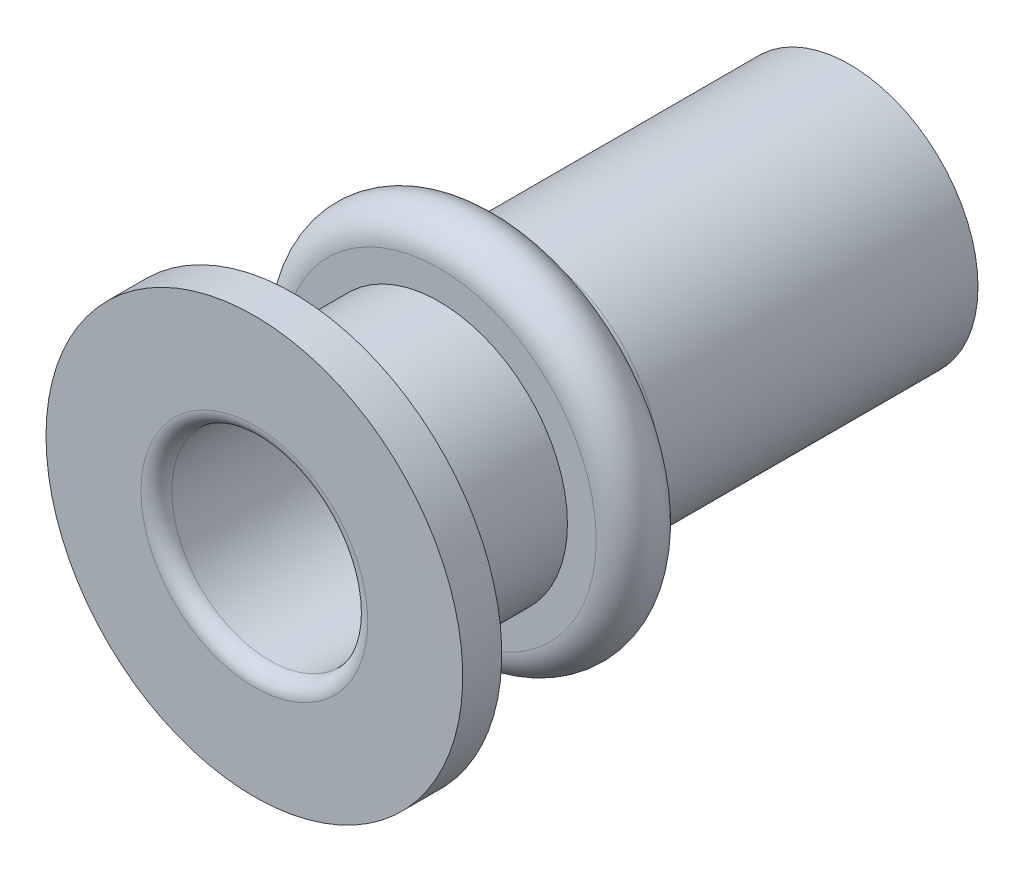
ISO-10303-21;
HEADER;
FILE_DESCRIPTION(('STEP AP214'),'2;1');
FILE_NAME('part.step','',(''),(''),'','','');
FILE_SCHEMA(('AUTOMOTIVE_DESIGN { 1 0 10303 214 1 1 1 1 }'));
ENDSEC;
DATA;
#1=APPLICATION_CONTEXT('core data for automotive mechanical design processes');
#2=APPLICATION_PROTOCOL_DEFINITION('international standard','automotive_design',2000,#1);
#3=PRODUCT_CONTEXT('',#1,'mechanical');
#4=PRODUCT('Part','Part','',(#3));
#5=PRODUCT_RELATED_PRODUCT_CATEGORY('part','',(#4));
#6=PRODUCT_DEFINITION_FORMATION('','',#4);
#7=PRODUCT_DEFINITION_CONTEXT('part definition',#1,'design');
#8=PRODUCT_DEFINITION('design','',#6,#7);
#9=PRODUCT_DEFINITION_SHAPE('','',#8);
#10=(LENGTH_UNIT() NAMED_UNIT(*) SI_UNIT(.MILLI.,.METRE.));
#11=(NAMED_UNIT(*) PLANE_ANGLE_UNIT() SI_UNIT($,.RADIAN.));
#12=(NAMED_UNIT(*) SI_UNIT($,.STERADIAN.) SOLID_ANGLE_UNIT());
#13=UNCERTAINTY_MEASURE_WITH_UNIT(LENGTH_MEASURE(1.E-05),#10,'distance_accuracy_value','');
#14=(GEOMETRIC_REPRESENTATION_CONTEXT(3) GLOBAL_UNCERTAINTY_ASSIGNED_CONTEXT((#13)) GLOBAL_UNIT_ASSIGNED_CONTEXT((#10,
#11,#12)) REPRESENTATION_CONTEXT('',''));
#15=CARTESIAN_POINT('',(0.,0.,0.));
#16=DIRECTION('',(0.,0.,1.));
#17=DIRECTION('',(1.,0.,0.));
#18=AXIS2_PLACEMENT_3D('',#15,#16,#17);
#19=CARTESIAN_POINT('',(0.,0.,2.82501387074931));
#20=DIRECTION('',(0.,0.,-1.));
#21=DIRECTION('',(-1.,0.,0.));
#22=AXIS2_PLACEMENT_3D('',#19,#20,#21);
#23=CYLINDRICAL_SURFACE('',#22,5.1562);
#24=CARTESIAN_POINT('',(0.,0.,0.));
#25=DIRECTION('',(0.,0.,-1.));
#26=DIRECTION('',(-1.,0.,0.));
#27=AXIS2_PLACEMENT_3D('',#24,#25,#26);
#28=CIRCLE('',#27,5.1562);
#29=CARTESIAN_POINT('',(-5.1562,0.,0.));
#30=VERTEX_POINT('',#29);
#31=EDGE_CURVE('E81',#30,#30,#28,.T.);
#32=ORIENTED_EDGE('',*,*,#31,.T.);
#33=EDGE_LOOP('',(#32));
#34=FACE_BOUND('',#33,.T.);
#35=CARTESIAN_POINT('',(0.,0.,-0.9652));
#36=DIRECTION('',(0.,0.,-1.));
#37=DIRECTION('',(-1.,0.,0.));
#38=AXIS2_PLACEMENT_3D('',#35,#36,#37);
#39=CIRCLE('',#38,5.1562);
#40=CARTESIAN_POINT('',(-5.1562,0.,-0.9652));
#41=VERTEX_POINT('',#40);
#42=EDGE_CURVE('E10',#41,#41,#39,.T.);
#43=ORIENTED_EDGE('',*,*,#42,.F.);
#44=EDGE_LOOP('',(#43));
#45=FACE_BOUND('',#44,.T.);
#46=ADVANCED_FACE('F32',(#34,#45),#23,.T.);
#47=CARTESIAN_POINT('',(0.,5.1562,-0.9652));
#48=DIRECTION('',(0.,0.,-1.));
#49=DIRECTION('',(-1.,0.,0.));
#50=AXIS2_PLACEMENT_3D('',#47,#48,#49);
#51=PLANE('',#50);
#52=ORIENTED_EDGE('',*,*,#42,.T.);
#53=EDGE_LOOP('',(#52));
#54=FACE_BOUND('',#53,.T.);
#55=CARTESIAN_POINT('',(0.,0.,-0.9652));
#56=DIRECTION('',(0.,0.,-1.));
#57=DIRECTION('',(-1.,0.,0.));
#58=AXIS2_PLACEMENT_3D('',#55,#56,#57);
#59=CIRCLE('',#58,3.175);
#60=CARTESIAN_POINT('',(-3.175,0.,-0.9652));
#61=VERTEX_POINT('',#60);
#62=EDGE_CURVE('E38',#61,#61,#59,.T.);
#63=ORIENTED_EDGE('',*,*,#62,.F.);
#64=EDGE_LOOP('',(#63));
#65=FACE_BOUND('',#64,.T.);
#66=ADVANCED_FACE('F99',(#54,#65),#51,.T.);
#67=CARTESIAN_POINT('',(0.,0.,2.82501387074931));
#68=DIRECTION('',(0.,0.,-1.));
#69=DIRECTION('',(-1.,0.,0.));
#70=AXIS2_PLACEMENT_3D('',#67,#68,#69);
#71=CYLINDRICAL_SURFACE('',#70,3.175);
#72=ORIENTED_EDGE('',*,*,#62,.T.);
#73=EDGE_LOOP('',(#72));
#74=FACE_BOUND('',#73,.T.);
#75=CARTESIAN_POINT('',(0.,0.,-4.572));
#76=DIRECTION('',(0.,0.,-1.));
#77=DIRECTION('',(-1.,0.,0.));
#78=AXIS2_PLACEMENT_3D('',#75,#76,#77);
#79=CIRCLE('',#78,3.175);
#80=CARTESIAN_POINT('',(-3.175,0.,-4.572));
#81=VERTEX_POINT('',#80);
#82=EDGE_CURVE('E42',#81,#81,#79,.T.);
#83=ORIENTED_EDGE('',*,*,#82,.F.);
#84=EDGE_LOOP('',(#83));
#85=FACE_BOUND('',#84,.T.);
#86=ADVANCED_FACE('F103',(#74,#85),#71,.T.);
#87=CARTESIAN_POINT('',(0.,3.175,-4.572));
#88=DIRECTION('',(0.,0.,1.));
#89=DIRECTION('',(1.,0.,0.));
#90=AXIS2_PLACEMENT_3D('',#87,#88,#89);
#91=PLANE('',#90);
#92=ORIENTED_EDGE('',*,*,#82,.T.);
#93=EDGE_LOOP('',(#92));
#94=FACE_BOUND('',#93,.T.);
#95=CARTESIAN_POINT('',(0.,0.,-4.572));
#96=DIRECTION('',(0.,0.,-1.));
#97=DIRECTION('',(-1.,0.,0.));
#98=AXIS2_PLACEMENT_3D('',#95,#96,#97);
#99=CIRCLE('',#98,3.88620000000002);
#100=CARTESIAN_POINT('',(-3.88620000000002,0.,-4.572));
#101=VERTEX_POINT('',#100);
#102=EDGE_CURVE('E46',#101,#101,#99,.T.);
#103=ORIENTED_EDGE('',*,*,#102,.F.);
#104=EDGE_LOOP('',(#103));
#105=FACE_BOUND('',#104,.T.);
#106=ADVANCED_FACE('F107',(#94,#105),#91,.T.);
#107=CARTESIAN_POINT('',(0.,0.,-5.334));
#108=DIRECTION('',(0.,0.,-1.));
#109=DIRECTION('',(-1.,0.,0.));
#110=AXIS2_PLACEMENT_3D('',#107,#108,#109);
#111=TOROIDAL_SURFACE('',#110,3.88620000000002,0.762000000000001);
#112=ORIENTED_EDGE('',*,*,#102,.T.);
#113=EDGE_LOOP('',(#112));
#114=FACE_BOUND('',#113,.T.);
#115=CARTESIAN_POINT('',(0.,0.,-6.096));
#116=DIRECTION('',(0.,0.,-1.));
#117=DIRECTION('',(-1.,0.,0.));
#118=AXIS2_PLACEMENT_3D('',#115,#116,#117);
#119=CIRCLE('',#118,3.88620000000002);
#120=CARTESIAN_POINT('',(-3.88620000000002,0.,-6.096));
#121=VERTEX_POINT('',#120);
#122=EDGE_CURVE('E51',#121,#121,#119,.T.);
#123=ORIENTED_EDGE('',*,*,#122,.F.);
#124=EDGE_LOOP('',(#123));
#125=FACE_BOUND('',#124,.T.);
#126=ADVANCED_FACE('F113',(#114,#125),#111,.T.);
#127=CARTESIAN_POINT('',(0.,3.88620000000002,-6.096));
#128=DIRECTION('',(0.,0.,1.));
#129=DIRECTION('',(1.,0.,0.));
#130=AXIS2_PLACEMENT_3D('',#127,#128,#129);
#131=PLANE('',#130);
#132=ORIENTED_EDGE('',*,*,#122,.T.);
#133=EDGE_LOOP('',(#132));
#134=FACE_BOUND('',#133,.T.);
#135=CARTESIAN_POINT('',(0.,0.,-6.096));
#136=DIRECTION('',(0.,0.,-1.));
#137=DIRECTION('',(-1.,0.,0.));
#138=AXIS2_PLACEMENT_3D('',#135,#136,#137);
#139=CIRCLE('',#138,3.93699999999999);
#140=CARTESIAN_POINT('',(-3.93699999999999,0.,-6.096));
#141=VERTEX_POINT('',#140);
#142=EDGE_CURVE('E54',#141,#141,#139,.T.);
#143=ORIENTED_EDGE('',*,*,#142,.F.);
#144=EDGE_LOOP('',(#143));
#145=FACE_BOUND('',#144,.T.);
#146=ADVANCED_FACE('F117',(#134,#145),#131,.T.);
#147=CARTESIAN_POINT('',(0.,0.,-6.858));
#148=DIRECTION('',(0.,0.,-1.));
#149=DIRECTION('',(-1.,0.,0.));
#150=AXIS2_PLACEMENT_3D('',#147,#148,#149);
#151=TOROIDAL_SURFACE('',#150,3.93699999999999,0.761999999999999);
#152=ORIENTED_EDGE('',*,*,#142,.T.);
#153=EDGE_LOOP('',(#152));
#154=FACE_BOUND('',#153,.T.);
#155=CARTESIAN_POINT('',(0.,0.,-6.858));
#156=DIRECTION('',(0.,0.,-1.));
#157=DIRECTION('',(-1.,0.,0.));
#158=AXIS2_PLACEMENT_3D('',#155,#156,#157);
#159=CIRCLE('',#158,3.17499999999999);
#160=CARTESIAN_POINT('',(-3.17499999999999,0.,-6.858));
#161=VERTEX_POINT('',#160);
#162=EDGE_CURVE('E57',#161,#161,#159,.T.);
#163=ORIENTED_EDGE('',*,*,#162,.F.);
#164=EDGE_LOOP('',(#163));
#165=FACE_BOUND('',#164,.T.);
#166=ADVANCED_FACE('F121',(#154,#165),#151,.F.);
#167=CARTESIAN_POINT('',(0.,0.,2.82501387074931));
#168=DIRECTION('',(0.,0.,-1.));
#169=DIRECTION('',(-1.,0.,0.));
#170=AXIS2_PLACEMENT_3D('',#167,#168,#169);
#171=CYLINDRICAL_SURFACE('',#170,3.175);
#172=ORIENTED_EDGE('',*,*,#162,.T.);
#173=EDGE_LOOP('',(#172));
#174=FACE_BOUND('',#173,.T.);
#175=CARTESIAN_POINT('',(0.,0.,-14.732));
#176=DIRECTION('',(0.,0.,-1.));
#177=DIRECTION('',(-1.,0.,0.));
#178=AXIS2_PLACEMENT_3D('',#175,#176,#177);
#179=CIRCLE('',#178,3.175);
#180=CARTESIAN_POINT('',(-3.175,0.,-14.732));
#181=VERTEX_POINT('',#180);
#182=EDGE_CURVE('E60',#181,#181,#179,.T.);
#183=ORIENTED_EDGE('',*,*,#182,.F.);
#184=EDGE_LOOP('',(#183));
#185=FACE_BOUND('',#184,.T.);
#186=ADVANCED_FACE('F125',(#174,#185),#171,.T.);
#187=CARTESIAN_POINT('',(0.,2.4257,-14.732));
#188=DIRECTION('',(0.,0.,-1.));
#189=DIRECTION('',(-1.,0.,0.));
#190=AXIS2_PLACEMENT_3D('',#187,#188,#189);
#191=PLANE('',#190);
#192=ORIENTED_EDGE('',*,*,#182,.T.);
#193=EDGE_LOOP('',(#192));
#194=FACE_BOUND('',#193,.T.);
#195=CARTESIAN_POINT('',(0.,0.,-14.732));
#196=DIRECTION('',(0.,0.,-1.));
#197=DIRECTION('',(-1.,0.,0.));
#198=AXIS2_PLACEMENT_3D('',#195,#196,#197);
#199=CIRCLE('',#198,2.4257);
#200=CARTESIAN_POINT('',(-2.4257,0.,-14.732));
#201=VERTEX_POINT('',#200);
#202=EDGE_CURVE('E63',#201,#201,#199,.T.);
#203=ORIENTED_EDGE('',*,*,#202,.F.);
#204=EDGE_LOOP('',(#203));
#205=FACE_BOUND('',#204,.T.);
#206=ADVANCED_FACE('F129',(#194,#205),#191,.T.);
#207=CARTESIAN_POINT('',(0.,0.,-14.4973648506013));
#208=DIRECTION('',(0.,0.,-1.));
#209=DIRECTION('',(-1.,0.,0.));
#210=AXIS2_PLACEMENT_3D('',#207,#208,#209);
#211=CONICAL_SURFACE('',#210,2.0193,1.0471975511966);
#212=ORIENTED_EDGE('',*,*,#202,.T.);
#213=EDGE_LOOP('',(#212));
#214=FACE_BOUND('',#213,.T.);
#215=CARTESIAN_POINT('',(0.,0.,-14.4973648506013));
#216=DIRECTION('',(0.,0.,-1.));
#217=DIRECTION('',(-1.,0.,0.));
#218=AXIS2_PLACEMENT_3D('',#215,#216,#217);
#219=CIRCLE('',#218,2.0193);
#220=CARTESIAN_POINT('',(-2.0193,0.,-14.4973648506013));
#221=VERTEX_POINT('',#220);
#222=EDGE_CURVE('E66',#221,#221,#219,.T.);
#223=ORIENTED_EDGE('',*,*,#222,.F.);
#224=EDGE_LOOP('',(#223));
#225=FACE_BOUND('',#224,.T.);
#226=ADVANCED_FACE('F133',(#214,#225),#211,.F.);
#227=CARTESIAN_POINT('',(0.,0.,2.82501387074931));
#228=DIRECTION('',(0.,0.,-1.));
#229=DIRECTION('',(-1.,0.,0.));
#230=AXIS2_PLACEMENT_3D('',#227,#228,#229);
#231=CYLINDRICAL_SURFACE('',#230,2.0193);
#232=ORIENTED_EDGE('',*,*,#222,.T.);
#233=EDGE_LOOP('',(#232));
#234=FACE_BOUND('',#233,.T.);
#235=CARTESIAN_POINT('',(0.,0.,-7.09263514939866));
#236=DIRECTION('',(0.,0.,-1.));
#237=DIRECTION('',(-1.,0.,0.));
#238=AXIS2_PLACEMENT_3D('',#235,#236,#237);
#239=CIRCLE('',#238,2.0193);
#240=CARTESIAN_POINT('',(-2.0193,0.,-7.09263514939866));
#241=VERTEX_POINT('',#240);
#242=EDGE_CURVE('E69',#241,#241,#239,.T.);
#243=ORIENTED_EDGE('',*,*,#242,.F.);
#244=EDGE_LOOP('',(#243));
#245=FACE_BOUND('',#244,.T.);
#246=ADVANCED_FACE('F137',(#234,#245),#231,.F.);
#247=CARTESIAN_POINT('',(0.,0.,-6.858));
#248=DIRECTION('',(0.,0.,1.));
#249=DIRECTION('',(1.,0.,0.));
#250=AXIS2_PLACEMENT_3D('',#247,#248,#249);
#251=CONICAL_SURFACE('',#250,2.4257,1.0471975511966);
#252=ORIENTED_EDGE('',*,*,#242,.T.);
#253=EDGE_LOOP('',(#252));
#254=FACE_BOUND('',#253,.T.);
#255=CARTESIAN_POINT('',(0.,0.,-6.858));
#256=DIRECTION('',(0.,0.,-1.));
#257=DIRECTION('',(-1.,0.,0.));
#258=AXIS2_PLACEMENT_3D('',#255,#256,#257);
#259=CIRCLE('',#258,2.4257);
#260=CARTESIAN_POINT('',(-2.4257,0.,-6.858));
#261=VERTEX_POINT('',#260);
#262=EDGE_CURVE('E72',#261,#261,#259,.T.);
#263=ORIENTED_EDGE('',*,*,#262,.F.);
#264=EDGE_LOOP('',(#263));
#265=FACE_BOUND('',#264,.T.);
#266=ADVANCED_FACE('F141',(#254,#265),#251,.F.);
#267=CARTESIAN_POINT('',(0.,0.,2.82501387074931));
#268=DIRECTION('',(0.,0.,-1.));
#269=DIRECTION('',(-1.,0.,0.));
#270=AXIS2_PLACEMENT_3D('',#267,#268,#269);
#271=CYLINDRICAL_SURFACE('',#270,2.4257);
#272=ORIENTED_EDGE('',*,*,#262,.T.);
#273=EDGE_LOOP('',(#272));
#274=FACE_BOUND('',#273,.T.);
#275=CARTESIAN_POINT('',(0.,0.,-0.381000000000003));
#276=DIRECTION('',(0.,0.,-1.));
#277=DIRECTION('',(-1.,0.,0.));
#278=AXIS2_PLACEMENT_3D('',#275,#276,#277);
#279=CIRCLE('',#278,2.4257);
#280=CARTESIAN_POINT('',(-2.4257,0.,-0.381000000000003));
#281=VERTEX_POINT('',#280);
#282=EDGE_CURVE('E75',#281,#281,#279,.T.);
#283=ORIENTED_EDGE('',*,*,#282,.F.);
#284=EDGE_LOOP('',(#283));
#285=FACE_BOUND('',#284,.T.);
#286=ADVANCED_FACE('F95',(#274,#285),#271,.F.);
#287=CARTESIAN_POINT('',(0.,0.,-0.381));
#288=DIRECTION('',(0.,0.,-1.));
#289=DIRECTION('',(-1.,0.,0.));
#290=AXIS2_PLACEMENT_3D('',#287,#288,#289);
#291=TOROIDAL_SURFACE('',#290,2.8067,0.381);
#292=ORIENTED_EDGE('',*,*,#282,.T.);
#293=EDGE_LOOP('',(#292));
#294=FACE_BOUND('',#293,.T.);
#295=CARTESIAN_POINT('',(0.,0.,0.));
#296=DIRECTION('',(0.,0.,-1.));
#297=DIRECTION('',(-1.,0.,0.));
#298=AXIS2_PLACEMENT_3D('',#295,#296,#297);
#299=CIRCLE('',#298,2.8067);
#300=CARTESIAN_POINT('',(-2.8067,0.,0.));
#301=VERTEX_POINT('',#300);
#302=EDGE_CURVE('E78',#301,#301,#299,.T.);
#303=ORIENTED_EDGE('',*,*,#302,.F.);
#304=EDGE_LOOP('',(#303));
#305=FACE_BOUND('',#304,.T.);
#306=ADVANCED_FACE('F89',(#294,#305),#291,.T.);
#307=CARTESIAN_POINT('',(0.,2.8067,0.));
#308=DIRECTION('',(0.,0.,1.));
#309=DIRECTION('',(1.,0.,0.));
#310=AXIS2_PLACEMENT_3D('',#307,#308,#309);
#311=PLANE('',#310);
#312=ORIENTED_EDGE('',*,*,#302,.T.);
#313=EDGE_LOOP('',(#312));
#314=FACE_BOUND('',#313,.T.);
#315=ORIENTED_EDGE('',*,*,#31,.F.);
#316=EDGE_LOOP('',(#315));
#317=FACE_BOUND('',#316,.T.);
#318=ADVANCED_FACE('F87',(#314,#317),#311,.T.);
#319=CLOSED_SHELL('',(#46,#66,#86,#106,#126,#146,#166,#186,#206,#226,#246,#266,#286,#306,#318));
#320=MANIFOLD_SOLID_BREP('B2',#319);
#321=ADVANCED_BREP_SHAPE_REPRESENTATION('',(#18,#320),#14);
#322=SHAPE_DEFINITION_REPRESENTATION(#9,#321);
ENDSEC;
END-ISO-10303-21;
